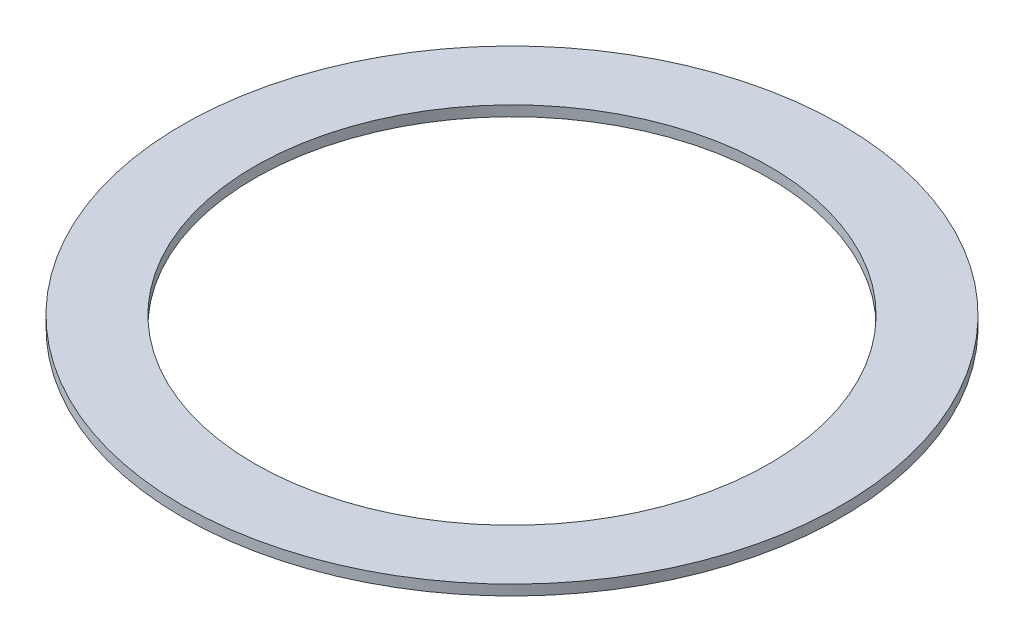
ISO-10303-21;
HEADER;
FILE_DESCRIPTION(('STEP AP214'),'2;1');
FILE_NAME('part.step','',(''),(''),'','','');
FILE_SCHEMA(('AUTOMOTIVE_DESIGN { 1 0 10303 214 1 1 1 1 }'));
ENDSEC;
DATA;
#1=APPLICATION_CONTEXT('core data for automotive mechanical design processes');
#2=APPLICATION_PROTOCOL_DEFINITION('international standard','automotive_design',2000,#1);
#3=PRODUCT_CONTEXT('',#1,'mechanical');
#4=PRODUCT('Part','Part','',(#3));
#5=PRODUCT_RELATED_PRODUCT_CATEGORY('part','',(#4));
#6=PRODUCT_DEFINITION_FORMATION('','',#4);
#7=PRODUCT_DEFINITION_CONTEXT('part definition',#1,'design');
#8=PRODUCT_DEFINITION('design','',#6,#7);
#9=PRODUCT_DEFINITION_SHAPE('','',#8);
#10=(LENGTH_UNIT() NAMED_UNIT(*) SI_UNIT(.MILLI.,.METRE.));
#11=(NAMED_UNIT(*) PLANE_ANGLE_UNIT() SI_UNIT($,.RADIAN.));
#12=(NAMED_UNIT(*) SI_UNIT($,.STERADIAN.) SOLID_ANGLE_UNIT());
#13=UNCERTAINTY_MEASURE_WITH_UNIT(LENGTH_MEASURE(1.E-05),#10,'distance_accuracy_value','');
#14=(GEOMETRIC_REPRESENTATION_CONTEXT(3) GLOBAL_UNCERTAINTY_ASSIGNED_CONTEXT((#13)) GLOBAL_UNIT_ASSIGNED_CONTEXT((#10,
#11,#12)) REPRESENTATION_CONTEXT('',''));
#15=CARTESIAN_POINT('',(0.,0.,0.));
#16=DIRECTION('',(0.,0.,1.));
#17=DIRECTION('',(1.,0.,0.));
#18=AXIS2_PLACEMENT_3D('',#15,#16,#17);
#19=CARTESIAN_POINT('',(0.,0.5,0.));
#20=DIRECTION('',(0.,1.,0.));
#21=DIRECTION('',(0.,0.,1.));
#22=AXIS2_PLACEMENT_3D('',#19,#20,#21);
#23=PLANE('',#22);
#24=CARTESIAN_POINT('',(0.,0.5,0.));
#25=DIRECTION('',(0.,1.,0.));
#26=DIRECTION('',(0.,0.,1.));
#27=AXIS2_PLACEMENT_3D('',#24,#25,#26);
#28=CIRCLE('',#27,16.);
#29=CARTESIAN_POINT('',(0.,0.5,16.));
#30=VERTEX_POINT('',#29);
#31=EDGE_CURVE('E10',#30,#30,#28,.T.);
#32=ORIENTED_EDGE('',*,*,#31,.T.);
#33=EDGE_LOOP('',(#32));
#34=FACE_BOUND('',#33,.T.);
#35=CARTESIAN_POINT('',(0.,0.5,0.));
#36=DIRECTION('',(0.,1.,0.));
#37=DIRECTION('',(0.,0.,1.));
#38=AXIS2_PLACEMENT_3D('',#35,#36,#37);
#39=CIRCLE('',#38,12.5);
#40=CARTESIAN_POINT('',(0.,0.5,12.5));
#41=VERTEX_POINT('',#40);
#42=EDGE_CURVE('E43',#41,#41,#39,.T.);
#43=ORIENTED_EDGE('',*,*,#42,.F.);
#44=EDGE_LOOP('',(#43));
#45=FACE_BOUND('',#44,.T.);
#46=ADVANCED_FACE('F32',(#34,#45),#23,.T.);
#47=CARTESIAN_POINT('',(0.,0.,0.));
#48=DIRECTION('',(0.,1.,0.));
#49=DIRECTION('',(0.,0.,1.));
#50=AXIS2_PLACEMENT_3D('',#47,#48,#49);
#51=PLANE('',#50);
#52=CARTESIAN_POINT('',(0.,0.,0.));
#53=DIRECTION('',(0.,1.,0.));
#54=DIRECTION('',(0.,0.,1.));
#55=AXIS2_PLACEMENT_3D('',#52,#53,#54);
#56=CIRCLE('',#55,16.);
#57=CARTESIAN_POINT('',(0.,0.,16.));
#58=VERTEX_POINT('',#57);
#59=EDGE_CURVE('E36',#58,#58,#56,.T.);
#60=ORIENTED_EDGE('',*,*,#59,.F.);
#61=EDGE_LOOP('',(#60));
#62=FACE_BOUND('',#61,.T.);
#63=CARTESIAN_POINT('',(0.,0.,0.));
#64=DIRECTION('',(0.,1.,0.));
#65=DIRECTION('',(0.,0.,1.));
#66=AXIS2_PLACEMENT_3D('',#63,#64,#65);
#67=CIRCLE('',#66,12.5);
#68=CARTESIAN_POINT('',(0.,0.,12.5));
#69=VERTEX_POINT('',#68);
#70=EDGE_CURVE('E45',#69,#69,#67,.T.);
#71=ORIENTED_EDGE('',*,*,#70,.T.);
#72=EDGE_LOOP('',(#71));
#73=FACE_BOUND('',#72,.T.);
#74=ADVANCED_FACE('F55',(#62,#73),#51,.F.);
#75=CARTESIAN_POINT('',(0.,0.5,0.));
#76=DIRECTION('',(0.,-1.,0.));
#77=DIRECTION('',(0.,0.,-1.));
#78=AXIS2_PLACEMENT_3D('',#75,#76,#77);
#79=CYLINDRICAL_SURFACE('',#78,16.);
#80=ORIENTED_EDGE('',*,*,#31,.F.);
#81=EDGE_LOOP('',(#80));
#82=FACE_BOUND('',#81,.T.);
#83=ORIENTED_EDGE('',*,*,#59,.T.);
#84=EDGE_LOOP('',(#83));
#85=FACE_BOUND('',#84,.T.);
#86=ADVANCED_FACE('F34',(#82,#85),#79,.T.);
#87=CARTESIAN_POINT('',(0.,0.5,0.));
#88=DIRECTION('',(0.,-1.,0.));
#89=DIRECTION('',(0.,0.,-1.));
#90=AXIS2_PLACEMENT_3D('',#87,#88,#89);
#91=CYLINDRICAL_SURFACE('',#90,12.5);
#92=ORIENTED_EDGE('',*,*,#42,.T.);
#93=EDGE_LOOP('',(#92));
#94=FACE_BOUND('',#93,.T.);
#95=ORIENTED_EDGE('',*,*,#70,.F.);
#96=EDGE_LOOP('',(#95));
#97=FACE_BOUND('',#96,.T.);
#98=ADVANCED_FACE('F51',(#94,#97),#91,.F.);
#99=CLOSED_SHELL('',(#46,#74,#86,#98));
#100=MANIFOLD_SOLID_BREP('B2',#99);
#101=ADVANCED_BREP_SHAPE_REPRESENTATION('',(#18,#100),#14);
#102=SHAPE_DEFINITION_REPRESENTATION(#9,#101);
ENDSEC;
END-ISO-10303-21;
